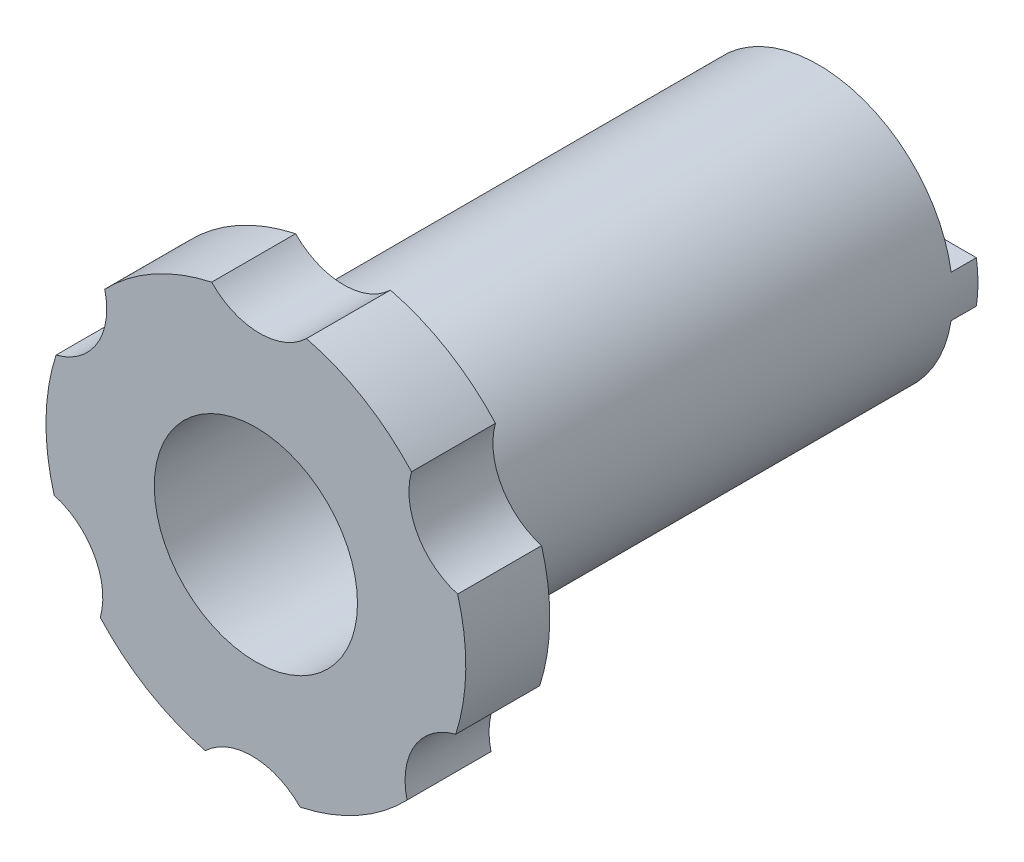
ISO-10303-21;
HEADER;
FILE_DESCRIPTION(('STEP AP214'),'2;1');
FILE_NAME('part.step','',(''),(''),'','','');
FILE_SCHEMA(('AUTOMOTIVE_DESIGN { 1 0 10303 214 1 1 1 1 }'));
ENDSEC;
DATA;
#1=APPLICATION_CONTEXT('core data for automotive mechanical design processes');
#2=APPLICATION_PROTOCOL_DEFINITION('international standard','automotive_design',2000,#1);
#3=PRODUCT_CONTEXT('',#1,'mechanical');
#4=PRODUCT('Part','Part','',(#3));
#5=PRODUCT_RELATED_PRODUCT_CATEGORY('part','',(#4));
#6=PRODUCT_DEFINITION_FORMATION('','',#4);
#7=PRODUCT_DEFINITION_CONTEXT('part definition',#1,'design');
#8=PRODUCT_DEFINITION('design','',#6,#7);
#9=PRODUCT_DEFINITION_SHAPE('','',#8);
#10=(LENGTH_UNIT() NAMED_UNIT(*) SI_UNIT(.MILLI.,.METRE.));
#11=(NAMED_UNIT(*) PLANE_ANGLE_UNIT() SI_UNIT($,.RADIAN.));
#12=(NAMED_UNIT(*) SI_UNIT($,.STERADIAN.) SOLID_ANGLE_UNIT());
#13=UNCERTAINTY_MEASURE_WITH_UNIT(LENGTH_MEASURE(1.E-05),#10,'distance_accuracy_value','');
#14=(GEOMETRIC_REPRESENTATION_CONTEXT(3) GLOBAL_UNCERTAINTY_ASSIGNED_CONTEXT((#13)) GLOBAL_UNIT_ASSIGNED_CONTEXT((#10,
#11,#12)) REPRESENTATION_CONTEXT('',''));
#15=CARTESIAN_POINT('',(0.,0.,0.));
#16=DIRECTION('',(0.,0.,1.));
#17=DIRECTION('',(1.,0.,0.));
#18=AXIS2_PLACEMENT_3D('',#15,#16,#17);
#19=CARTESIAN_POINT('',(0.,0.,35.));
#20=DIRECTION('',(0.,0.,-1.));
#21=DIRECTION('',(-1.,0.,0.));
#22=AXIS2_PLACEMENT_3D('',#19,#20,#21);
#23=CYLINDRICAL_SURFACE('',#22,12.5);
#24=CARTESIAN_POINT('',(0.,0.,30.));
#25=DIRECTION('',(0.,0.,1.));
#26=DIRECTION('',(1.,0.,0.));
#27=AXIS2_PLACEMENT_3D('',#24,#25,#26);
#28=CIRCLE('',#27,12.5);
#29=CARTESIAN_POINT('',(-11.8992118644781,3.82867562014125,30.));
#30=VERTEX_POINT('',#29);
#31=CARTESIAN_POINT('',(-12.0120959187214,-3.45825846914837,30.));
#32=VERTEX_POINT('',#31);
#33=EDGE_CURVE('E253',#30,#32,#28,.T.);
#34=ORIENTED_EDGE('',*,*,#33,.T.);
#35=DIRECTION('',(0.,0.,1.));
#36=VECTOR('',#35,1.);
#37=CARTESIAN_POINT('',(-12.0120959187214,-3.45825846914837,17.500006));
#38=LINE('',#37,#36);
#39=CARTESIAN_POINT('',(-12.0129725257444,-3.45800720146771,35.000012));
#40=VERTEX_POINT('',#39);
#41=EDGE_CURVE('E11',#32,#40,#38,.T.);
#42=ORIENTED_EDGE('',*,*,#41,.T.);
#43=CARTESIAN_POINT('',(0.,0.,35.));
#44=DIRECTION('',(0.,0.,1.));
#45=DIRECTION('',(1.,0.,0.));
#46=AXIS2_PLACEMENT_3D('',#43,#44,#45);
#47=CIRCLE('',#46,12.5);
#48=CARTESIAN_POINT('',(-11.899791156043,3.82851429592535,35.0000117146349));
#49=VERTEX_POINT('',#48);
#50=EDGE_CURVE('E213',#49,#40,#47,.T.);
#51=ORIENTED_EDGE('',*,*,#50,.F.);
#52=DIRECTION('',(0.,0.,1.));
#53=VECTOR('',#52,1.);
#54=CARTESIAN_POINT('',(-11.8992118644781,3.82867562014125,17.500006));
#55=LINE('',#54,#53);
#56=EDGE_CURVE('E187',#49,#30,#55,.F.);
#57=ORIENTED_EDGE('',*,*,#56,.T.);
#58=EDGE_LOOP('',(#34,#42,#51,#57));
#59=FACE_BOUND('',#58,.T.);
#60=ADVANCED_FACE('F39',(#59),#23,.T.);
#61=CARTESIAN_POINT('',(-9.26533865586498,-8.39094485407307,35.000009889367));
#62=VERTEX_POINT('',#61);
#63=CARTESIAN_POINT('',(-3.01200189861796,-12.1327726628071,35.000012));
#64=VERTEX_POINT('',#63);
#65=EDGE_CURVE('E220',#62,#64,#47,.T.);
#66=ORIENTED_EDGE('',*,*,#65,.F.);
#67=DIRECTION('',(0.,0.,1.));
#68=VECTOR('',#67,1.);
#69=CARTESIAN_POINT('',(-9.2653362821315,-8.3906819495806,17.500006));
#70=LINE('',#69,#68);
#71=CARTESIAN_POINT('',(-9.26533628213149,-8.39068194958061,30.));
#72=VERTEX_POINT('',#71);
#73=EDGE_CURVE('E49',#62,#72,#70,.F.);
#74=ORIENTED_EDGE('',*,*,#73,.T.);
#75=CARTESIAN_POINT('',(-3.01110827222554,-12.1319094528823,30.));
#76=VERTEX_POINT('',#75);
#77=EDGE_CURVE('E261',#72,#76,#28,.T.);
#78=ORIENTED_EDGE('',*,*,#77,.T.);
#79=DIRECTION('',(0.,0.,1.));
#80=VECTOR('',#79,1.);
#81=CARTESIAN_POINT('',(-3.01110827222554,-12.1319094528823,17.500006));
#82=LINE('',#81,#80);
#83=EDGE_CURVE('E349',#76,#64,#82,.T.);
#84=ORIENTED_EDGE('',*,*,#83,.T.);
#85=EDGE_LOOP('',(#66,#74,#78,#84));
#86=FACE_BOUND('',#85,.T.);
#87=ADVANCED_FACE('F358',(#86),#23,.T.);
#88=CARTESIAN_POINT('',(2.63482985822383,-12.2203383269847,35.000012));
#89=VERTEX_POINT('',#88);
#90=CARTESIAN_POINT('',(9.00096781415482,-8.67386922679809,35.000009515103));
#91=VERTEX_POINT('',#90);
#92=EDGE_CURVE('E232',#89,#91,#47,.T.);
#93=ORIENTED_EDGE('',*,*,#92,.F.);
#94=DIRECTION('',(0.,0.,1.));
#95=VECTOR('',#94,1.);
#96=CARTESIAN_POINT('',(2.63387558234659,-12.2193575697218,17.500006));
#97=LINE('',#96,#95);
#98=CARTESIAN_POINT('',(2.6338755823466,-12.2193575697218,30.));
#99=VERTEX_POINT('',#98);
#100=EDGE_CURVE('E348',#89,#99,#97,.F.);
#101=ORIENTED_EDGE('',*,*,#100,.T.);
#102=CARTESIAN_POINT('',(9.00098764649588,-8.67365098373393,30.));
#103=VERTEX_POINT('',#102);
#104=EDGE_CURVE('E254',#99,#103,#28,.T.);
#105=ORIENTED_EDGE('',*,*,#104,.T.);
#106=DIRECTION('',(0.,0.,1.));
#107=VECTOR('',#106,1.);
#108=CARTESIAN_POINT('',(9.00098764649588,-8.67365098373393,17.500006));
#109=LINE('',#108,#107);
#110=EDGE_CURVE('E412',#103,#91,#109,.T.);
#111=ORIENTED_EDGE('',*,*,#110,.T.);
#112=EDGE_LOOP('',(#93,#101,#105,#111));
#113=FACE_BOUND('',#112,.T.);
#114=ADVANCED_FACE('F548',(#113),#23,.T.);
#115=CARTESIAN_POINT('',(11.8997955892705,-3.82851381770373,35.000011728203));
#116=VERTEX_POINT('',#115);
#117=CARTESIAN_POINT('',(12.0129656148621,3.45800918153398,35.000012));
#118=VERTEX_POINT('',#117);
#119=EDGE_CURVE('E229',#116,#118,#47,.T.);
#120=ORIENTED_EDGE('',*,*,#119,.F.);
#121=DIRECTION('',(0.,0.,1.));
#122=VECTOR('',#121,1.);
#123=CARTESIAN_POINT('',(11.8992118644781,-3.82867562014125,17.500006));
#124=LINE('',#123,#122);
#125=CARTESIAN_POINT('',(11.8992118644781,-3.82867562014125,30.));
#126=VERTEX_POINT('',#125);
#127=EDGE_CURVE('E420',#116,#126,#124,.F.);
#128=ORIENTED_EDGE('',*,*,#127,.T.);
#129=CARTESIAN_POINT('',(12.0120959187214,3.45825846914837,30.));
#130=VERTEX_POINT('',#129);
#131=EDGE_CURVE('E248',#126,#130,#28,.T.);
#132=ORIENTED_EDGE('',*,*,#131,.T.);
#133=DIRECTION('',(0.,0.,1.));
#134=VECTOR('',#133,1.);
#135=CARTESIAN_POINT('',(12.0120959187214,3.45825846914837,17.500006));
#136=LINE('',#135,#134);
#137=EDGE_CURVE('E421',#130,#118,#136,.T.);
#138=ORIENTED_EDGE('',*,*,#137,.T.);
#139=EDGE_LOOP('',(#120,#128,#132,#138));
#140=FACE_BOUND('',#139,.T.);
#141=ADVANCED_FACE('F559',(#140),#23,.T.);
#142=CARTESIAN_POINT('',(9.26534155666939,8.39094336471594,35.0000099531878));
#143=VERTEX_POINT('',#142);
#144=CARTESIAN_POINT('',(3.01200188410802,12.1327726487867,35.000012));
#145=VERTEX_POINT('',#144);
#146=EDGE_CURVE('E215',#143,#145,#47,.T.);
#147=ORIENTED_EDGE('',*,*,#146,.F.);
#148=DIRECTION('',(0.,0.,1.));
#149=VECTOR('',#148,1.);
#150=CARTESIAN_POINT('',(9.2653362821315,8.3906819495806,17.500006));
#151=LINE('',#150,#149);
#152=CARTESIAN_POINT('',(9.2653362821315,8.3906819495806,30.));
#153=VERTEX_POINT('',#152);
#154=EDGE_CURVE('E430',#143,#153,#151,.F.);
#155=ORIENTED_EDGE('',*,*,#154,.T.);
#156=CARTESIAN_POINT('',(3.01110827222554,12.1319094528823,30.));
#157=VERTEX_POINT('',#156);
#158=EDGE_CURVE('E242',#153,#157,#28,.T.);
#159=ORIENTED_EDGE('',*,*,#158,.T.);
#160=DIRECTION('',(0.,0.,1.));
#161=VECTOR('',#160,1.);
#162=CARTESIAN_POINT('',(3.01110827222554,12.1319094528823,17.500006));
#163=LINE('',#162,#161);
#164=EDGE_CURVE('E431',#157,#145,#163,.T.);
#165=ORIENTED_EDGE('',*,*,#164,.T.);
#166=EDGE_LOOP('',(#147,#155,#159,#165));
#167=FACE_BOUND('',#166,.T.);
#168=ADVANCED_FACE('F555',(#167),#23,.T.);
#169=CARTESIAN_POINT('',(0.,0.,0.));
#170=DIRECTION('',(0.,0.,1.));
#171=DIRECTION('',(1.,0.,0.));
#172=AXIS2_PLACEMENT_3D('',#169,#170,#171);
#173=PLANE('',#172);
#174=DIRECTION('',(1.,0.,0.));
#175=VECTOR('',#174,1.);
#176=CARTESIAN_POINT('',(-8.,-1.25,0.));
#177=LINE('',#176,#175);
#178=CARTESIAN_POINT('',(-7.90174031463955,-1.25,0.));
#179=VERTEX_POINT('',#178);
#180=CARTESIAN_POINT('',(-5.9194594347795,-1.25,0.));
#181=VERTEX_POINT('',#180);
#182=EDGE_CURVE('E496',#179,#181,#177,.T.);
#183=ORIENTED_EDGE('',*,*,#182,.F.);
#184=CARTESIAN_POINT('',(0.,0.,0.));
#185=DIRECTION('',(0.,0.,1.));
#186=DIRECTION('',(1.,0.,0.));
#187=AXIS2_PLACEMENT_3D('',#184,#185,#186);
#188=CIRCLE('',#187,8.);
#189=CARTESIAN_POINT('',(-7.90174031463955,1.25,0.));
#190=VERTEX_POINT('',#189);
#191=EDGE_CURVE('E470',#190,#179,#188,.T.);
#192=ORIENTED_EDGE('',*,*,#191,.F.);
#193=DIRECTION('',(1.,0.,0.));
#194=VECTOR('',#193,1.);
#195=CARTESIAN_POINT('',(-8.,1.25,0.));
#196=LINE('',#195,#194);
#197=CARTESIAN_POINT('',(-5.9194594347795,1.25,0.));
#198=VERTEX_POINT('',#197);
#199=EDGE_CURVE('E500',#190,#198,#196,.T.);
#200=ORIENTED_EDGE('',*,*,#199,.T.);
#201=CARTESIAN_POINT('',(0.,0.,0.));
#202=DIRECTION('',(0.,0.,1.));
#203=DIRECTION('',(1.,0.,0.));
#204=AXIS2_PLACEMENT_3D('',#201,#202,#203);
#205=CIRCLE('',#204,6.05);
#206=EDGE_CURVE('E466',#198,#181,#205,.T.);
#207=ORIENTED_EDGE('',*,*,#206,.T.);
#208=EDGE_LOOP('',(#183,#192,#200,#207));
#209=FACE_BOUND('',#208,.T.);
#210=ADVANCED_FACE('F513',(#209),#173,.F.);
#211=CARTESIAN_POINT('',(5.9194594347795,-1.25,0.));
#212=VERTEX_POINT('',#211);
#213=CARTESIAN_POINT('',(7.90174031463955,-1.25,0.));
#214=VERTEX_POINT('',#213);
#215=EDGE_CURVE('E499',#212,#214,#177,.T.);
#216=ORIENTED_EDGE('',*,*,#215,.F.);
#217=CARTESIAN_POINT('',(5.9194594347795,1.25,0.));
#218=VERTEX_POINT('',#217);
#219=EDGE_CURVE('E473',#212,#218,#205,.T.);
#220=ORIENTED_EDGE('',*,*,#219,.T.);
#221=CARTESIAN_POINT('',(7.90174031463955,1.25,0.));
#222=VERTEX_POINT('',#221);
#223=EDGE_CURVE('E493',#218,#222,#196,.T.);
#224=ORIENTED_EDGE('',*,*,#223,.T.);
#225=EDGE_CURVE('E461',#214,#222,#188,.T.);
#226=ORIENTED_EDGE('',*,*,#225,.F.);
#227=EDGE_LOOP('',(#216,#220,#224,#226));
#228=FACE_BOUND('',#227,.T.);
#229=ADVANCED_FACE('F529',(#228),#173,.F.);
#230=CARTESIAN_POINT('',(0.,0.,30.));
#231=DIRECTION('',(0.,0.,-1.));
#232=DIRECTION('',(-1.,0.,0.));
#233=AXIS2_PLACEMENT_3D('',#230,#231,#232);
#234=CYLINDRICAL_SURFACE('',#233,8.);
#235=CARTESIAN_POINT('',(0.,0.,30.));
#236=DIRECTION('',(0.,0.,1.));
#237=DIRECTION('',(1.,0.,0.));
#238=AXIS2_PLACEMENT_3D('',#235,#236,#237);
#239=CIRCLE('',#238,8.);
#240=CARTESIAN_POINT('',(8.,0.,30.));
#241=VERTEX_POINT('',#240);
#242=EDGE_CURVE('E464',#241,#241,#239,.T.);
#243=ORIENTED_EDGE('',*,*,#242,.F.);
#244=EDGE_LOOP('',(#243));
#245=FACE_BOUND('',#244,.T.);
#246=CARTESIAN_POINT('',(0.,0.,1.5));
#247=DIRECTION('',(0.,0.,1.));
#248=DIRECTION('',(1.,0.,0.));
#249=AXIS2_PLACEMENT_3D('',#246,#247,#248);
#250=CIRCLE('',#249,8.);
#251=CARTESIAN_POINT('',(-7.90174031463955,-1.25,1.5));
#252=VERTEX_POINT('',#251);
#253=CARTESIAN_POINT('',(7.90174031463955,-1.25,1.5));
#254=VERTEX_POINT('',#253);
#255=EDGE_CURVE('E475',#252,#254,#250,.T.);
#256=ORIENTED_EDGE('',*,*,#255,.T.);
#257=DIRECTION('',(0.,0.,-1.));
#258=VECTOR('',#257,1.);
#259=CARTESIAN_POINT('',(7.90174031463955,-1.25,30.));
#260=LINE('',#259,#258);
#261=EDGE_CURVE('E478',#254,#214,#260,.T.);
#262=ORIENTED_EDGE('',*,*,#261,.T.);
#263=ORIENTED_EDGE('',*,*,#225,.T.);
#264=DIRECTION('',(0.,0.,-1.));
#265=VECTOR('',#264,1.);
#266=CARTESIAN_POINT('',(7.90174031463955,1.25,30.));
#267=LINE('',#266,#265);
#268=CARTESIAN_POINT('',(7.90174031463955,1.25,1.5));
#269=VERTEX_POINT('',#268);
#270=EDGE_CURVE('E484',#222,#269,#267,.F.);
#271=ORIENTED_EDGE('',*,*,#270,.T.);
#272=CARTESIAN_POINT('',(0.,0.,1.5));
#273=DIRECTION('',(0.,0.,1.));
#274=DIRECTION('',(1.,0.,0.));
#275=AXIS2_PLACEMENT_3D('',#272,#273,#274);
#276=CIRCLE('',#275,8.);
#277=CARTESIAN_POINT('',(-7.90174031463955,1.25,1.5));
#278=VERTEX_POINT('',#277);
#279=EDGE_CURVE('E488',#269,#278,#276,.T.);
#280=ORIENTED_EDGE('',*,*,#279,.T.);
#281=DIRECTION('',(0.,0.,-1.));
#282=VECTOR('',#281,1.);
#283=CARTESIAN_POINT('',(-7.90174031463955,1.25,30.));
#284=LINE('',#283,#282);
#285=EDGE_CURVE('E485',#278,#190,#284,.T.);
#286=ORIENTED_EDGE('',*,*,#285,.T.);
#287=ORIENTED_EDGE('',*,*,#191,.T.);
#288=DIRECTION('',(0.,0.,-1.));
#289=VECTOR('',#288,1.);
#290=CARTESIAN_POINT('',(-7.90174031463955,-1.25,30.));
#291=LINE('',#290,#289);
#292=EDGE_CURVE('E479',#179,#252,#291,.F.);
#293=ORIENTED_EDGE('',*,*,#292,.T.);
#294=EDGE_LOOP('',(#256,#262,#263,#271,#280,#286,#287,#293));
#295=FACE_BOUND('',#294,.T.);
#296=ADVANCED_FACE('F41',(#245,#295),#234,.T.);
#297=CARTESIAN_POINT('',(0.,0.,30.));
#298=DIRECTION('',(0.,0.,-1.));
#299=DIRECTION('',(-1.,0.,0.));
#300=AXIS2_PLACEMENT_3D('',#297,#298,#299);
#301=CYLINDRICAL_SURFACE('',#300,6.05);
#302=DIRECTION('',(0.,0.,-1.));
#303=VECTOR('',#302,1.);
#304=CARTESIAN_POINT('',(5.9194594347795,-1.25,30.));
#305=LINE('',#304,#303);
#306=CARTESIAN_POINT('',(5.9194594347795,-1.25,1.5));
#307=VERTEX_POINT('',#306);
#308=EDGE_CURVE('E224',#307,#212,#305,.T.);
#309=ORIENTED_EDGE('',*,*,#308,.F.);
#310=CARTESIAN_POINT('',(0.,0.,1.5));
#311=DIRECTION('',(0.,0.,1.));
#312=DIRECTION('',(1.,0.,0.));
#313=AXIS2_PLACEMENT_3D('',#310,#311,#312);
#314=CIRCLE('',#313,6.05);
#315=CARTESIAN_POINT('',(-5.9194594347795,-1.25,1.5));
#316=VERTEX_POINT('',#315);
#317=EDGE_CURVE('E441',#316,#307,#314,.T.);
#318=ORIENTED_EDGE('',*,*,#317,.F.);
#319=DIRECTION('',(0.,0.,-1.));
#320=VECTOR('',#319,1.);
#321=CARTESIAN_POINT('',(-5.9194594347795,-1.25,30.));
#322=LINE('',#321,#320);
#323=EDGE_CURVE('E446',#181,#316,#322,.F.);
#324=ORIENTED_EDGE('',*,*,#323,.F.);
#325=ORIENTED_EDGE('',*,*,#206,.F.);
#326=DIRECTION('',(0.,0.,-1.));
#327=VECTOR('',#326,1.);
#328=CARTESIAN_POINT('',(-5.9194594347795,1.25,30.));
#329=LINE('',#328,#327);
#330=CARTESIAN_POINT('',(-5.9194594347795,1.25,1.5));
#331=VERTEX_POINT('',#330);
#332=EDGE_CURVE('E454',#331,#198,#329,.T.);
#333=ORIENTED_EDGE('',*,*,#332,.F.);
#334=CARTESIAN_POINT('',(0.,0.,1.5));
#335=DIRECTION('',(0.,0.,1.));
#336=DIRECTION('',(1.,0.,0.));
#337=AXIS2_PLACEMENT_3D('',#334,#335,#336);
#338=CIRCLE('',#337,6.05);
#339=CARTESIAN_POINT('',(5.9194594347795,1.25,1.5));
#340=VERTEX_POINT('',#339);
#341=EDGE_CURVE('E462',#340,#331,#338,.T.);
#342=ORIENTED_EDGE('',*,*,#341,.F.);
#343=DIRECTION('',(0.,0.,-1.));
#344=VECTOR('',#343,1.);
#345=CARTESIAN_POINT('',(5.9194594347795,1.25,30.));
#346=LINE('',#345,#344);
#347=EDGE_CURVE('E456',#218,#340,#346,.F.);
#348=ORIENTED_EDGE('',*,*,#347,.F.);
#349=ORIENTED_EDGE('',*,*,#219,.F.);
#350=EDGE_LOOP('',(#309,#318,#324,#325,#333,#342,#348,#349));
#351=FACE_BOUND('',#350,.T.);
#352=CARTESIAN_POINT('',(0.,0.,35.));
#353=DIRECTION('',(0.,0.,1.));
#354=DIRECTION('',(1.,0.,0.));
#355=AXIS2_PLACEMENT_3D('',#352,#353,#354);
#356=CIRCLE('',#355,6.05);
#357=CARTESIAN_POINT('',(6.05,0.,35.));
#358=VERTEX_POINT('',#357);
#359=EDGE_CURVE('E258',#358,#358,#356,.T.);
#360=ORIENTED_EDGE('',*,*,#359,.T.);
#361=EDGE_LOOP('',(#360));
#362=FACE_BOUND('',#361,.T.);
#363=ADVANCED_FACE('F515',(#351,#362),#301,.F.);
#364=CARTESIAN_POINT('',(-8.,1.25,1.5));
#365=DIRECTION('',(0.,-1.,0.));
#366=DIRECTION('',(0.,0.,-1.));
#367=AXIS2_PLACEMENT_3D('',#364,#365,#366);
#368=PLANE('',#367);
#369=DIRECTION('',(1.,0.,0.));
#370=VECTOR('',#369,1.);
#371=CARTESIAN_POINT('',(-8.,1.25,1.5));
#372=LINE('',#371,#370);
#373=EDGE_CURVE('E492',#278,#331,#372,.T.);
#374=ORIENTED_EDGE('',*,*,#373,.T.);
#375=ORIENTED_EDGE('',*,*,#332,.T.);
#376=ORIENTED_EDGE('',*,*,#199,.F.);
#377=ORIENTED_EDGE('',*,*,#285,.F.);
#378=EDGE_LOOP('',(#374,#375,#376,#377));
#379=FACE_BOUND('',#378,.T.);
#380=ADVANCED_FACE('F516',(#379),#368,.F.);
#381=ORIENTED_EDGE('',*,*,#223,.F.);
#382=ORIENTED_EDGE('',*,*,#347,.T.);
#383=EDGE_CURVE('E214',#340,#269,#372,.T.);
#384=ORIENTED_EDGE('',*,*,#383,.T.);
#385=ORIENTED_EDGE('',*,*,#270,.F.);
#386=EDGE_LOOP('',(#381,#382,#384,#385));
#387=FACE_BOUND('',#386,.T.);
#388=ADVANCED_FACE('F522',(#387),#368,.F.);
#389=CARTESIAN_POINT('',(-8.,1.25,1.5));
#390=DIRECTION('',(0.,0.,1.));
#391=DIRECTION('',(1.,0.,0.));
#392=AXIS2_PLACEMENT_3D('',#389,#390,#391);
#393=PLANE('',#392);
#394=ORIENTED_EDGE('',*,*,#383,.F.);
#395=ORIENTED_EDGE('',*,*,#341,.T.);
#396=ORIENTED_EDGE('',*,*,#373,.F.);
#397=ORIENTED_EDGE('',*,*,#279,.F.);
#398=EDGE_LOOP('',(#394,#395,#396,#397));
#399=FACE_BOUND('',#398,.T.);
#400=ADVANCED_FACE('F521',(#399),#393,.F.);
#401=CARTESIAN_POINT('',(-8.,-8.,1.5));
#402=DIRECTION('',(0.,0.,1.));
#403=DIRECTION('',(1.,0.,0.));
#404=AXIS2_PLACEMENT_3D('',#401,#402,#403);
#405=PLANE('',#404);
#406=DIRECTION('',(1.,0.,0.));
#407=VECTOR('',#406,1.);
#408=CARTESIAN_POINT('',(-8.,-1.25,1.5));
#409=LINE('',#408,#407);
#410=EDGE_CURVE('E489',#252,#316,#409,.T.);
#411=ORIENTED_EDGE('',*,*,#410,.T.);
#412=ORIENTED_EDGE('',*,*,#317,.T.);
#413=EDGE_CURVE('E498',#307,#254,#409,.T.);
#414=ORIENTED_EDGE('',*,*,#413,.T.);
#415=ORIENTED_EDGE('',*,*,#255,.F.);
#416=EDGE_LOOP('',(#411,#412,#414,#415));
#417=FACE_BOUND('',#416,.T.);
#418=ADVANCED_FACE('F534',(#417),#405,.F.);
#419=CARTESIAN_POINT('',(-8.,-1.25,0.));
#420=DIRECTION('',(0.,1.,0.));
#421=DIRECTION('',(0.,0.,1.));
#422=AXIS2_PLACEMENT_3D('',#419,#420,#421);
#423=PLANE('',#422);
#424=ORIENTED_EDGE('',*,*,#413,.F.);
#425=ORIENTED_EDGE('',*,*,#308,.T.);
#426=ORIENTED_EDGE('',*,*,#215,.T.);
#427=ORIENTED_EDGE('',*,*,#261,.F.);
#428=EDGE_LOOP('',(#424,#425,#426,#427));
#429=FACE_BOUND('',#428,.T.);
#430=ADVANCED_FACE('F531',(#429),#423,.F.);
#431=ORIENTED_EDGE('',*,*,#182,.T.);
#432=ORIENTED_EDGE('',*,*,#323,.T.);
#433=ORIENTED_EDGE('',*,*,#410,.F.);
#434=ORIENTED_EDGE('',*,*,#292,.F.);
#435=EDGE_LOOP('',(#431,#432,#433,#434));
#436=FACE_BOUND('',#435,.T.);
#437=ADVANCED_FACE('F501',(#436),#423,.F.);
#438=CARTESIAN_POINT('',(0.,0.,35.));
#439=DIRECTION('',(0.,0.,1.));
#440=DIRECTION('',(1.,0.,0.));
#441=AXIS2_PLACEMENT_3D('',#438,#439,#440);
#442=PLANE('',#441);
#443=CARTESIAN_POINT('',(-13.1146972124701,-7.30329037890201,35.000012));
#444=DIRECTION('',(0.,0.,1.));
#445=DIRECTION('',(0.96232288699728,-0.27190928847912,0.));
#446=AXIS2_PLACEMENT_3D('',#443,#444,#445);
#447=CIRCLE('',#446,4.);
#448=EDGE_CURVE('E355',#62,#40,#447,.T.);
#449=ORIENTED_EDGE('',*,*,#448,.F.);
#450=ORIENTED_EDGE('',*,*,#65,.T.);
#451=CARTESIAN_POINT('',(-0.232513606891421,-15.0093061383911,35.000012));
#452=DIRECTION('',(0.,0.,1.));
#453=DIRECTION('',(0.716835866278813,0.697241952851594,0.));
#454=AXIS2_PLACEMENT_3D('',#451,#452,#453);
#455=CIRCLE('',#454,4.);
#456=EDGE_CURVE('E338',#89,#64,#455,.T.);
#457=ORIENTED_EDGE('',*,*,#456,.F.);
#458=ORIENTED_EDGE('',*,*,#92,.T.);
#459=CARTESIAN_POINT('',(12.8821836055787,-7.70601575948906,35.000012));
#460=DIRECTION('',(0.,0.,1.));
#461=DIRECTION('',(-0.245594864566253,0.969372561247059,0.));
#462=AXIS2_PLACEMENT_3D('',#459,#460,#461);
#463=CIRCLE('',#462,4.);
#464=EDGE_CURVE('E329',#116,#91,#463,.T.);
#465=ORIENTED_EDGE('',*,*,#464,.F.);
#466=ORIENTED_EDGE('',*,*,#119,.T.);
#467=CARTESIAN_POINT('',(13.1146972124701,7.30329037890201,35.000012));
#468=DIRECTION('',(0.,0.,1.));
#469=DIRECTION('',(-0.962322886989933,0.271909288505121,0.));
#470=AXIS2_PLACEMENT_3D('',#467,#468,#469);
#471=CIRCLE('',#470,4.);
#472=EDGE_CURVE('E390',#143,#118,#471,.T.);
#473=ORIENTED_EDGE('',*,*,#472,.F.);
#474=ORIENTED_EDGE('',*,*,#146,.T.);
#475=CARTESIAN_POINT('',(0.232513606891427,15.0093061383911,35.000012));
#476=DIRECTION('',(0.,0.,1.));
#477=DIRECTION('',(-0.71683587599371,-0.697241942863688,0.));
#478=AXIS2_PLACEMENT_3D('',#475,#476,#477);
#479=CIRCLE('',#478,4.);
#480=CARTESIAN_POINT('',(-2.63482989708341,12.2203383669363,35.000012));
#481=VERTEX_POINT('',#480);
#482=EDGE_CURVE('E191',#481,#145,#479,.T.);
#483=ORIENTED_EDGE('',*,*,#482,.F.);
#484=CARTESIAN_POINT('',(-9.00096810887125,8.67386309802315,35.0000095086402));
#485=VERTEX_POINT('',#484);
#486=EDGE_CURVE('E203',#481,#485,#47,.T.);
#487=ORIENTED_EDGE('',*,*,#486,.T.);
#488=CARTESIAN_POINT('',(-12.8821836055787,7.70601575948906,35.000012));
#489=DIRECTION('',(0.,0.,1.));
#490=DIRECTION('',(0.245595886232065,-0.969372302402894,0.));
#491=AXIS2_PLACEMENT_3D('',#488,#489,#490);
#492=CIRCLE('',#491,4.);
#493=EDGE_CURVE('E179',#49,#485,#492,.T.);
#494=ORIENTED_EDGE('',*,*,#493,.F.);
#495=ORIENTED_EDGE('',*,*,#50,.T.);
#496=EDGE_LOOP('',(#449,#450,#457,#458,#465,#466,#473,#474,#483,#487,#494,#495));
#497=FACE_BOUND('',#496,.T.);
#498=ORIENTED_EDGE('',*,*,#359,.F.);
#499=EDGE_LOOP('',(#498));
#500=FACE_BOUND('',#499,.T.);
#501=ADVANCED_FACE('F208',(#497,#500),#442,.T.);
#502=CARTESIAN_POINT('',(0.,0.,30.));
#503=DIRECTION('',(0.,0.,1.));
#504=DIRECTION('',(1.,0.,0.));
#505=AXIS2_PLACEMENT_3D('',#502,#503,#504);
#506=PLANE('',#505);
#507=ORIENTED_EDGE('',*,*,#242,.T.);
#508=EDGE_LOOP('',(#507));
#509=FACE_BOUND('',#508,.T.);
#510=ORIENTED_EDGE('',*,*,#77,.F.);
#511=CARTESIAN_POINT('',(-13.1146972124701,-7.30329037890201,30.));
#512=DIRECTION('',(0.,0.,1.));
#513=DIRECTION('',(1.,0.,0.));
#514=AXIS2_PLACEMENT_3D('',#511,#512,#513);
#515=CIRCLE('',#514,4.);
#516=EDGE_CURVE('E263',#72,#32,#515,.T.);
#517=ORIENTED_EDGE('',*,*,#516,.T.);
#518=ORIENTED_EDGE('',*,*,#33,.F.);
#519=CARTESIAN_POINT('',(-12.8821836055787,7.70601575948906,30.));
#520=DIRECTION('',(0.,0.,1.));
#521=DIRECTION('',(1.,0.,0.));
#522=AXIS2_PLACEMENT_3D('',#519,#520,#521);
#523=CIRCLE('',#522,4.);
#524=CARTESIAN_POINT('',(-9.00098764649587,8.67365098373394,30.));
#525=VERTEX_POINT('',#524);
#526=EDGE_CURVE('E195',#30,#525,#523,.T.);
#527=ORIENTED_EDGE('',*,*,#526,.T.);
#528=CARTESIAN_POINT('',(-2.63387558234659,12.2193575697218,30.));
#529=VERTEX_POINT('',#528);
#530=EDGE_CURVE('E201',#529,#525,#28,.T.);
#531=ORIENTED_EDGE('',*,*,#530,.F.);
#532=CARTESIAN_POINT('',(0.232513606891427,15.0093061383911,30.));
#533=DIRECTION('',(0.,0.,1.));
#534=DIRECTION('',(1.,0.,0.));
#535=AXIS2_PLACEMENT_3D('',#532,#533,#534);
#536=CIRCLE('',#535,4.);
#537=EDGE_CURVE('E562',#529,#157,#536,.T.);
#538=ORIENTED_EDGE('',*,*,#537,.T.);
#539=ORIENTED_EDGE('',*,*,#158,.F.);
#540=CARTESIAN_POINT('',(13.1146972124701,7.30329037890201,30.));
#541=DIRECTION('',(0.,0.,1.));
#542=DIRECTION('',(1.,0.,0.));
#543=AXIS2_PLACEMENT_3D('',#540,#541,#542);
#544=CIRCLE('',#543,4.);
#545=EDGE_CURVE('E566',#153,#130,#544,.T.);
#546=ORIENTED_EDGE('',*,*,#545,.T.);
#547=ORIENTED_EDGE('',*,*,#131,.F.);
#548=CARTESIAN_POINT('',(12.8821836055787,-7.70601575948906,30.));
#549=DIRECTION('',(0.,0.,1.));
#550=DIRECTION('',(1.,0.,0.));
#551=AXIS2_PLACEMENT_3D('',#548,#549,#550);
#552=CIRCLE('',#551,4.);
#553=EDGE_CURVE('E59',#126,#103,#552,.T.);
#554=ORIENTED_EDGE('',*,*,#553,.T.);
#555=ORIENTED_EDGE('',*,*,#104,.F.);
#556=CARTESIAN_POINT('',(-0.232513606891421,-15.0093061383911,30.));
#557=DIRECTION('',(0.,0.,1.));
#558=DIRECTION('',(1.,0.,0.));
#559=AXIS2_PLACEMENT_3D('',#556,#557,#558);
#560=CIRCLE('',#559,4.);
#561=EDGE_CURVE('E68',#99,#76,#560,.T.);
#562=ORIENTED_EDGE('',*,*,#561,.T.);
#563=EDGE_LOOP('',(#510,#517,#518,#527,#531,#538,#539,#546,#547,#554,#555,#562));
#564=FACE_BOUND('',#563,.T.);
#565=ADVANCED_FACE('F552',(#509,#564),#506,.F.);
#566=ORIENTED_EDGE('',*,*,#486,.F.);
#567=DIRECTION('',(0.,0.,1.));
#568=VECTOR('',#567,1.);
#569=CARTESIAN_POINT('',(-2.63387558234659,12.2193575697218,17.500006));
#570=LINE('',#569,#568);
#571=EDGE_CURVE('E204',#481,#529,#570,.F.);
#572=ORIENTED_EDGE('',*,*,#571,.T.);
#573=ORIENTED_EDGE('',*,*,#530,.T.);
#574=DIRECTION('',(0.,0.,1.));
#575=VECTOR('',#574,1.);
#576=CARTESIAN_POINT('',(-9.00098764649587,8.67365098373394,17.500006));
#577=LINE('',#576,#575);
#578=EDGE_CURVE('E181',#525,#485,#577,.T.);
#579=ORIENTED_EDGE('',*,*,#578,.T.);
#580=EDGE_LOOP('',(#566,#572,#573,#579));
#581=FACE_BOUND('',#580,.T.);
#582=ADVANCED_FACE('F200',(#581),#23,.T.);
#583=CARTESIAN_POINT('',(-12.8821836055787,7.70601575948906,0.));
#584=DIRECTION('',(0.,0.,1.));
#585=DIRECTION('',(1.,0.,0.));
#586=AXIS2_PLACEMENT_3D('',#583,#584,#585);
#587=CYLINDRICAL_SURFACE('',#586,4.);
#588=ORIENTED_EDGE('',*,*,#526,.F.);
#589=ORIENTED_EDGE('',*,*,#56,.F.);
#590=ORIENTED_EDGE('',*,*,#493,.T.);
#591=ORIENTED_EDGE('',*,*,#578,.F.);
#592=EDGE_LOOP('',(#588,#589,#590,#591));
#593=FACE_BOUND('',#592,.T.);
#594=ADVANCED_FACE('F185',(#593),#587,.F.);
#595=CARTESIAN_POINT('',(0.232513606891427,15.0093061383911,0.));
#596=DIRECTION('',(0.,0.,1.));
#597=DIRECTION('',(1.,0.,0.));
#598=AXIS2_PLACEMENT_3D('',#595,#596,#597);
#599=CYLINDRICAL_SURFACE('',#598,4.);
#600=ORIENTED_EDGE('',*,*,#537,.F.);
#601=ORIENTED_EDGE('',*,*,#571,.F.);
#602=ORIENTED_EDGE('',*,*,#482,.T.);
#603=ORIENTED_EDGE('',*,*,#164,.F.);
#604=EDGE_LOOP('',(#600,#601,#602,#603));
#605=FACE_BOUND('',#604,.T.);
#606=ADVANCED_FACE('F289',(#605),#599,.F.);
#607=CARTESIAN_POINT('',(13.1146972124701,7.30329037890201,0.));
#608=DIRECTION('',(0.,0.,1.));
#609=DIRECTION('',(1.,0.,0.));
#610=AXIS2_PLACEMENT_3D('',#607,#608,#609);
#611=CYLINDRICAL_SURFACE('',#610,4.);
#612=ORIENTED_EDGE('',*,*,#545,.F.);
#613=ORIENTED_EDGE('',*,*,#154,.F.);
#614=ORIENTED_EDGE('',*,*,#472,.T.);
#615=ORIENTED_EDGE('',*,*,#137,.F.);
#616=EDGE_LOOP('',(#612,#613,#614,#615));
#617=FACE_BOUND('',#616,.T.);
#618=ADVANCED_FACE('F312',(#617),#611,.F.);
#619=CARTESIAN_POINT('',(12.8821836055787,-7.70601575948906,0.));
#620=DIRECTION('',(0.,0.,1.));
#621=DIRECTION('',(1.,0.,0.));
#622=AXIS2_PLACEMENT_3D('',#619,#620,#621);
#623=CYLINDRICAL_SURFACE('',#622,4.);
#624=ORIENTED_EDGE('',*,*,#553,.F.);
#625=ORIENTED_EDGE('',*,*,#127,.F.);
#626=ORIENTED_EDGE('',*,*,#464,.T.);
#627=ORIENTED_EDGE('',*,*,#110,.F.);
#628=EDGE_LOOP('',(#624,#625,#626,#627));
#629=FACE_BOUND('',#628,.T.);
#630=ADVANCED_FACE('F318',(#629),#623,.F.);
#631=CARTESIAN_POINT('',(-0.232513606891421,-15.0093061383911,0.));
#632=DIRECTION('',(0.,0.,1.));
#633=DIRECTION('',(1.,0.,0.));
#634=AXIS2_PLACEMENT_3D('',#631,#632,#633);
#635=CYLINDRICAL_SURFACE('',#634,4.);
#636=ORIENTED_EDGE('',*,*,#561,.F.);
#637=ORIENTED_EDGE('',*,*,#100,.F.);
#638=ORIENTED_EDGE('',*,*,#456,.T.);
#639=ORIENTED_EDGE('',*,*,#83,.F.);
#640=EDGE_LOOP('',(#636,#637,#638,#639));
#641=FACE_BOUND('',#640,.T.);
#642=ADVANCED_FACE('F284',(#641),#635,.F.);
#643=CARTESIAN_POINT('',(-13.1146972124701,-7.30329037890201,0.));
#644=DIRECTION('',(0.,0.,1.));
#645=DIRECTION('',(1.,0.,0.));
#646=AXIS2_PLACEMENT_3D('',#643,#644,#645);
#647=CYLINDRICAL_SURFACE('',#646,4.);
#648=ORIENTED_EDGE('',*,*,#516,.F.);
#649=ORIENTED_EDGE('',*,*,#73,.F.);
#650=ORIENTED_EDGE('',*,*,#448,.T.);
#651=ORIENTED_EDGE('',*,*,#41,.F.);
#652=EDGE_LOOP('',(#648,#649,#650,#651));
#653=FACE_BOUND('',#652,.T.);
#654=ADVANCED_FACE('F272',(#653),#647,.F.);
#655=CLOSED_SHELL('',(#60,#87,#114,#141,#168,#210,#229,#296,#363,#380,#388,#400,#418,#430,#437,
#501,#565,#582,#594,#606,#618,#630,#642,#654));
#656=MANIFOLD_SOLID_BREP('B2',#655);
#657=ADVANCED_BREP_SHAPE_REPRESENTATION('',(#18,#656),#14);
#658=SHAPE_DEFINITION_REPRESENTATION(#9,#657);
ENDSEC;
END-ISO-10303-21;
